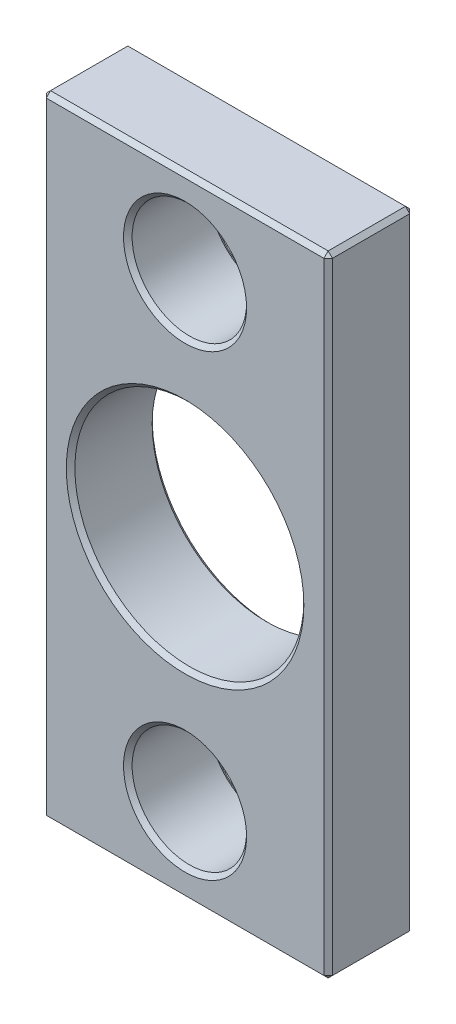
ISO-10303-21;
HEADER;
FILE_DESCRIPTION(('STEP AP214'),'2;1');
FILE_NAME('part.step','',(''),(''),'','','');
FILE_SCHEMA(('AUTOMOTIVE_DESIGN { 1 0 10303 214 1 1 1 1 }'));
ENDSEC;
DATA;
#1=APPLICATION_CONTEXT('core data for automotive mechanical design processes');
#2=APPLICATION_PROTOCOL_DEFINITION('international standard','automotive_design',2000,#1);
#3=PRODUCT_CONTEXT('',#1,'mechanical');
#4=PRODUCT('Part','Part','',(#3));
#5=PRODUCT_RELATED_PRODUCT_CATEGORY('part','',(#4));
#6=PRODUCT_DEFINITION_FORMATION('','',#4);
#7=PRODUCT_DEFINITION_CONTEXT('part definition',#1,'design');
#8=PRODUCT_DEFINITION('design','',#6,#7);
#9=PRODUCT_DEFINITION_SHAPE('','',#8);
#10=(LENGTH_UNIT() NAMED_UNIT(*) SI_UNIT(.MILLI.,.METRE.));
#11=(NAMED_UNIT(*) PLANE_ANGLE_UNIT() SI_UNIT($,.RADIAN.));
#12=(NAMED_UNIT(*) SI_UNIT($,.STERADIAN.) SOLID_ANGLE_UNIT());
#13=UNCERTAINTY_MEASURE_WITH_UNIT(LENGTH_MEASURE(1.E-05),#10,'distance_accuracy_value','');
#14=(GEOMETRIC_REPRESENTATION_CONTEXT(3) GLOBAL_UNCERTAINTY_ASSIGNED_CONTEXT((#13)) GLOBAL_UNIT_ASSIGNED_CONTEXT((#10,
#11,#12)) REPRESENTATION_CONTEXT('',''));
#15=CARTESIAN_POINT('',(0.,0.,0.));
#16=DIRECTION('',(0.,0.,1.));
#17=DIRECTION('',(1.,0.,0.));
#18=AXIS2_PLACEMENT_3D('',#15,#16,#17);
#19=CARTESIAN_POINT('',(0.,0.,1.5));
#20=DIRECTION('',(0.,0.,1.));
#21=DIRECTION('',(1.,0.,0.));
#22=AXIS2_PLACEMENT_3D('',#19,#20,#21);
#23=PLANE('',#22);
#24=CARTESIAN_POINT('',(0.,8.,1.5));
#25=DIRECTION('',(0.,0.,1.));
#26=DIRECTION('',(1.,0.,0.));
#27=AXIS2_PLACEMENT_3D('',#24,#25,#26);
#28=CIRCLE('',#27,2.15);
#29=CARTESIAN_POINT('',(2.15,8.,1.5));
#30=VERTEX_POINT('',#29);
#31=EDGE_CURVE('E228',#30,#30,#28,.F.);
#32=ORIENTED_EDGE('',*,*,#31,.T.);
#33=EDGE_LOOP('',(#32));
#34=FACE_BOUND('',#33,.T.);
#35=CARTESIAN_POINT('',(0.,0.,1.5));
#36=DIRECTION('',(0.,0.,1.));
#37=DIRECTION('',(1.,0.,0.));
#38=AXIS2_PLACEMENT_3D('',#35,#36,#37);
#39=CIRCLE('',#38,4.15);
#40=CARTESIAN_POINT('',(4.15,0.,1.5));
#41=VERTEX_POINT('',#40);
#42=EDGE_CURVE('E224',#41,#41,#39,.F.);
#43=ORIENTED_EDGE('',*,*,#42,.T.);
#44=EDGE_LOOP('',(#43));
#45=FACE_BOUND('',#44,.T.);
#46=DIRECTION('',(0.,1.,0.));
#47=VECTOR('',#46,1.);
#48=CARTESIAN_POINT('',(4.85,11.,1.5));
#49=LINE('',#48,#47);
#50=CARTESIAN_POINT('',(4.85,-10.85,1.5));
#51=VERTEX_POINT('',#50);
#52=CARTESIAN_POINT('',(4.85,10.85,1.5));
#53=VERTEX_POINT('',#52);
#54=EDGE_CURVE('E225',#51,#53,#49,.T.);
#55=ORIENTED_EDGE('',*,*,#54,.T.);
#56=DIRECTION('',(-1.,0.,0.));
#57=VECTOR('',#56,1.);
#58=CARTESIAN_POINT('',(-5.,10.85,1.5));
#59=LINE('',#58,#57);
#60=CARTESIAN_POINT('',(-4.85,10.85,1.5));
#61=VERTEX_POINT('',#60);
#62=EDGE_CURVE('E222',#53,#61,#59,.T.);
#63=ORIENTED_EDGE('',*,*,#62,.T.);
#64=DIRECTION('',(0.,-1.,0.));
#65=VECTOR('',#64,1.);
#66=CARTESIAN_POINT('',(-4.85,-11.,1.5));
#67=LINE('',#66,#65);
#68=CARTESIAN_POINT('',(-4.85,-10.85,1.5));
#69=VERTEX_POINT('',#68);
#70=EDGE_CURVE('E288',#61,#69,#67,.T.);
#71=ORIENTED_EDGE('',*,*,#70,.T.);
#72=DIRECTION('',(1.,0.,0.));
#73=VECTOR('',#72,1.);
#74=CARTESIAN_POINT('',(5.,-10.85,1.5));
#75=LINE('',#74,#73);
#76=EDGE_CURVE('E230',#69,#51,#75,.T.);
#77=ORIENTED_EDGE('',*,*,#76,.T.);
#78=EDGE_LOOP('',(#55,#63,#71,#77));
#79=FACE_BOUND('',#78,.T.);
#80=CARTESIAN_POINT('',(0.,-8.,1.5));
#81=DIRECTION('',(0.,0.,1.));
#82=DIRECTION('',(1.,0.,0.));
#83=AXIS2_PLACEMENT_3D('',#80,#81,#82);
#84=CIRCLE('',#83,2.15);
#85=CARTESIAN_POINT('',(2.15,-8.,1.5));
#86=VERTEX_POINT('',#85);
#87=EDGE_CURVE('E325',#86,#86,#84,.F.);
#88=ORIENTED_EDGE('',*,*,#87,.T.);
#89=EDGE_LOOP('',(#88));
#90=FACE_BOUND('',#89,.T.);
#91=ADVANCED_FACE('F39',(#34,#45,#79,#90),#23,.T.);
#92=CARTESIAN_POINT('',(0.,0.,-1.5));
#93=DIRECTION('',(0.,0.,1.));
#94=DIRECTION('',(1.,0.,0.));
#95=AXIS2_PLACEMENT_3D('',#92,#93,#94);
#96=PLANE('',#95);
#97=CARTESIAN_POINT('',(0.,8.,-1.5));
#98=DIRECTION('',(0.,0.,1.));
#99=DIRECTION('',(1.,0.,0.));
#100=AXIS2_PLACEMENT_3D('',#97,#98,#99);
#101=CIRCLE('',#100,2.15);
#102=CARTESIAN_POINT('',(2.15,8.,-1.5));
#103=VERTEX_POINT('',#102);
#104=EDGE_CURVE('E348',#103,#103,#101,.T.);
#105=ORIENTED_EDGE('',*,*,#104,.T.);
#106=EDGE_LOOP('',(#105));
#107=FACE_BOUND('',#106,.T.);
#108=CARTESIAN_POINT('',(0.,-8.,-1.5));
#109=DIRECTION('',(0.,0.,1.));
#110=DIRECTION('',(1.,0.,0.));
#111=AXIS2_PLACEMENT_3D('',#108,#109,#110);
#112=CIRCLE('',#111,2.15);
#113=CARTESIAN_POINT('',(2.15,-8.,-1.5));
#114=VERTEX_POINT('',#113);
#115=EDGE_CURVE('E351',#114,#114,#112,.T.);
#116=ORIENTED_EDGE('',*,*,#115,.T.);
#117=EDGE_LOOP('',(#116));
#118=FACE_BOUND('',#117,.T.);
#119=CARTESIAN_POINT('',(0.,0.,-1.5));
#120=DIRECTION('',(0.,0.,1.));
#121=DIRECTION('',(1.,0.,0.));
#122=AXIS2_PLACEMENT_3D('',#119,#120,#121);
#123=CIRCLE('',#122,4.14999999999999);
#124=CARTESIAN_POINT('',(4.14999999999999,0.,-1.5));
#125=VERTEX_POINT('',#124);
#126=EDGE_CURVE('E354',#125,#125,#123,.T.);
#127=ORIENTED_EDGE('',*,*,#126,.T.);
#128=EDGE_LOOP('',(#127));
#129=FACE_BOUND('',#128,.T.);
#130=DIRECTION('',(0.,-1.,0.));
#131=VECTOR('',#130,1.);
#132=CARTESIAN_POINT('',(4.85,0.,-1.5));
#133=LINE('',#132,#131);
#134=CARTESIAN_POINT('',(4.85,10.85,-1.5));
#135=VERTEX_POINT('',#134);
#136=CARTESIAN_POINT('',(4.85,-10.85,-1.5));
#137=VERTEX_POINT('',#136);
#138=EDGE_CURVE('E138',#135,#137,#133,.T.);
#139=ORIENTED_EDGE('',*,*,#138,.T.);
#140=DIRECTION('',(-1.,0.,0.));
#141=VECTOR('',#140,1.);
#142=CARTESIAN_POINT('',(0.,-10.85,-1.5));
#143=LINE('',#142,#141);
#144=CARTESIAN_POINT('',(-4.85,-10.85,-1.5));
#145=VERTEX_POINT('',#144);
#146=EDGE_CURVE('E134',#137,#145,#143,.T.);
#147=ORIENTED_EDGE('',*,*,#146,.T.);
#148=DIRECTION('',(0.,1.,0.));
#149=VECTOR('',#148,1.);
#150=CARTESIAN_POINT('',(-4.85,0.,-1.5));
#151=LINE('',#150,#149);
#152=CARTESIAN_POINT('',(-4.85,10.85,-1.5));
#153=VERTEX_POINT('',#152);
#154=EDGE_CURVE('E129',#145,#153,#151,.T.);
#155=ORIENTED_EDGE('',*,*,#154,.T.);
#156=DIRECTION('',(1.,0.,0.));
#157=VECTOR('',#156,1.);
#158=CARTESIAN_POINT('',(0.,10.85,-1.5));
#159=LINE('',#158,#157);
#160=EDGE_CURVE('E132',#153,#135,#159,.T.);
#161=ORIENTED_EDGE('',*,*,#160,.T.);
#162=EDGE_LOOP('',(#139,#147,#155,#161));
#163=FACE_BOUND('',#162,.T.);
#164=ADVANCED_FACE('F131',(#107,#118,#129,#163),#96,.F.);
#165=CARTESIAN_POINT('',(-5.,11.,1.5));
#166=DIRECTION('',(1.,0.,0.));
#167=DIRECTION('',(0.,0.,-1.));
#168=AXIS2_PLACEMENT_3D('',#165,#166,#167);
#169=PLANE('',#168);
#170=DIRECTION('',(0.,-1.,0.));
#171=VECTOR('',#170,1.);
#172=CARTESIAN_POINT('',(-5.,11.,-1.35));
#173=LINE('',#172,#171);
#174=CARTESIAN_POINT('',(-5.,10.85,-1.35));
#175=VERTEX_POINT('',#174);
#176=CARTESIAN_POINT('',(-5.,-10.85,-1.35));
#177=VERTEX_POINT('',#176);
#178=EDGE_CURVE('E157',#175,#177,#173,.T.);
#179=ORIENTED_EDGE('',*,*,#178,.T.);
#180=DIRECTION('',(0.,0.,1.));
#181=VECTOR('',#180,1.);
#182=CARTESIAN_POINT('',(-5.,-10.85,1.5));
#183=LINE('',#182,#181);
#184=CARTESIAN_POINT('',(-5.,-10.85,1.35));
#185=VERTEX_POINT('',#184);
#186=EDGE_CURVE('E250',#177,#185,#183,.T.);
#187=ORIENTED_EDGE('',*,*,#186,.T.);
#188=DIRECTION('',(0.,1.,0.));
#189=VECTOR('',#188,1.);
#190=CARTESIAN_POINT('',(-5.,11.,1.35));
#191=LINE('',#190,#189);
#192=CARTESIAN_POINT('',(-5.,10.85,1.35));
#193=VERTEX_POINT('',#192);
#194=EDGE_CURVE('E245',#185,#193,#191,.T.);
#195=ORIENTED_EDGE('',*,*,#194,.T.);
#196=DIRECTION('',(0.,0.,-1.));
#197=VECTOR('',#196,1.);
#198=CARTESIAN_POINT('',(-5.,10.85,1.5));
#199=LINE('',#198,#197);
#200=EDGE_CURVE('E247',#193,#175,#199,.T.);
#201=ORIENTED_EDGE('',*,*,#200,.T.);
#202=EDGE_LOOP('',(#179,#187,#195,#201));
#203=FACE_BOUND('',#202,.T.);
#204=ADVANCED_FACE('F295',(#203),#169,.F.);
#205=CARTESIAN_POINT('',(-5.,-11.,1.5));
#206=DIRECTION('',(0.,1.,0.));
#207=DIRECTION('',(0.,0.,1.));
#208=AXIS2_PLACEMENT_3D('',#205,#206,#207);
#209=PLANE('',#208);
#210=DIRECTION('',(-1.,0.,0.));
#211=VECTOR('',#210,1.);
#212=CARTESIAN_POINT('',(-5.,-11.,1.35));
#213=LINE('',#212,#211);
#214=CARTESIAN_POINT('',(4.85,-11.,1.35));
#215=VERTEX_POINT('',#214);
#216=CARTESIAN_POINT('',(-4.85,-11.,1.35));
#217=VERTEX_POINT('',#216);
#218=EDGE_CURVE('E236',#215,#217,#213,.T.);
#219=ORIENTED_EDGE('',*,*,#218,.T.);
#220=DIRECTION('',(0.,0.,-1.));
#221=VECTOR('',#220,1.);
#222=CARTESIAN_POINT('',(-4.85,-11.,1.5));
#223=LINE('',#222,#221);
#224=CARTESIAN_POINT('',(-4.85,-11.,-1.35));
#225=VERTEX_POINT('',#224);
#226=EDGE_CURVE('E242',#217,#225,#223,.T.);
#227=ORIENTED_EDGE('',*,*,#226,.T.);
#228=DIRECTION('',(1.,0.,0.));
#229=VECTOR('',#228,1.);
#230=CARTESIAN_POINT('',(-5.,-11.,-1.35));
#231=LINE('',#230,#229);
#232=CARTESIAN_POINT('',(4.85,-11.,-1.35));
#233=VERTEX_POINT('',#232);
#234=EDGE_CURVE('E240',#225,#233,#231,.T.);
#235=ORIENTED_EDGE('',*,*,#234,.T.);
#236=DIRECTION('',(0.,0.,1.));
#237=VECTOR('',#236,1.);
#238=CARTESIAN_POINT('',(4.85,-11.,1.5));
#239=LINE('',#238,#237);
#240=EDGE_CURVE('E238',#233,#215,#239,.T.);
#241=ORIENTED_EDGE('',*,*,#240,.T.);
#242=EDGE_LOOP('',(#219,#227,#235,#241));
#243=FACE_BOUND('',#242,.T.);
#244=ADVANCED_FACE('F308',(#243),#209,.F.);
#245=CARTESIAN_POINT('',(5.,11.,1.5));
#246=DIRECTION('',(-1.,0.,0.));
#247=DIRECTION('',(0.,0.,1.));
#248=AXIS2_PLACEMENT_3D('',#245,#246,#247);
#249=PLANE('',#248);
#250=DIRECTION('',(0.,-1.,0.));
#251=VECTOR('',#250,1.);
#252=CARTESIAN_POINT('',(5.,-11.,1.35));
#253=LINE('',#252,#251);
#254=CARTESIAN_POINT('',(5.,10.85,1.35));
#255=VERTEX_POINT('',#254);
#256=CARTESIAN_POINT('',(5.,-10.85,1.35));
#257=VERTEX_POINT('',#256);
#258=EDGE_CURVE('E253',#255,#257,#253,.T.);
#259=ORIENTED_EDGE('',*,*,#258,.T.);
#260=DIRECTION('',(0.,0.,-1.));
#261=VECTOR('',#260,1.);
#262=CARTESIAN_POINT('',(5.,-10.85,1.5));
#263=LINE('',#262,#261);
#264=CARTESIAN_POINT('',(5.,-10.85,-1.35));
#265=VERTEX_POINT('',#264);
#266=EDGE_CURVE('E259',#257,#265,#263,.T.);
#267=ORIENTED_EDGE('',*,*,#266,.T.);
#268=DIRECTION('',(0.,1.,0.));
#269=VECTOR('',#268,1.);
#270=CARTESIAN_POINT('',(5.,11.,-1.35));
#271=LINE('',#270,#269);
#272=CARTESIAN_POINT('',(5.,10.85,-1.35));
#273=VERTEX_POINT('',#272);
#274=EDGE_CURVE('E257',#265,#273,#271,.T.);
#275=ORIENTED_EDGE('',*,*,#274,.T.);
#276=DIRECTION('',(0.,0.,1.));
#277=VECTOR('',#276,1.);
#278=CARTESIAN_POINT('',(5.,10.85,1.5));
#279=LINE('',#278,#277);
#280=EDGE_CURVE('E255',#273,#255,#279,.T.);
#281=ORIENTED_EDGE('',*,*,#280,.T.);
#282=EDGE_LOOP('',(#259,#267,#275,#281));
#283=FACE_BOUND('',#282,.T.);
#284=ADVANCED_FACE('F730',(#283),#249,.F.);
#285=CARTESIAN_POINT('',(-5.,11.,1.5));
#286=DIRECTION('',(0.,-1.,0.));
#287=DIRECTION('',(0.,0.,-1.));
#288=AXIS2_PLACEMENT_3D('',#285,#286,#287);
#289=PLANE('',#288);
#290=DIRECTION('',(1.,0.,0.));
#291=VECTOR('',#290,1.);
#292=CARTESIAN_POINT('',(5.,11.,1.35));
#293=LINE('',#292,#291);
#294=CARTESIAN_POINT('',(-4.85,11.,1.35));
#295=VERTEX_POINT('',#294);
#296=CARTESIAN_POINT('',(4.85,11.,1.35));
#297=VERTEX_POINT('',#296);
#298=EDGE_CURVE('E219',#295,#297,#293,.T.);
#299=ORIENTED_EDGE('',*,*,#298,.T.);
#300=DIRECTION('',(0.,0.,-1.));
#301=VECTOR('',#300,1.);
#302=CARTESIAN_POINT('',(4.85,11.,1.5));
#303=LINE('',#302,#301);
#304=CARTESIAN_POINT('',(4.85,11.,-1.35));
#305=VERTEX_POINT('',#304);
#306=EDGE_CURVE('E11',#297,#305,#303,.T.);
#307=ORIENTED_EDGE('',*,*,#306,.T.);
#308=DIRECTION('',(-1.,0.,0.));
#309=VECTOR('',#308,1.);
#310=CARTESIAN_POINT('',(-5.,11.,-1.35));
#311=LINE('',#310,#309);
#312=CARTESIAN_POINT('',(-4.85,11.,-1.35));
#313=VERTEX_POINT('',#312);
#314=EDGE_CURVE('E49',#305,#313,#311,.T.);
#315=ORIENTED_EDGE('',*,*,#314,.T.);
#316=DIRECTION('',(0.,0.,1.));
#317=VECTOR('',#316,1.);
#318=CARTESIAN_POINT('',(-4.85,11.,1.5));
#319=LINE('',#318,#317);
#320=EDGE_CURVE('E263',#313,#295,#319,.T.);
#321=ORIENTED_EDGE('',*,*,#320,.T.);
#322=EDGE_LOOP('',(#299,#307,#315,#321));
#323=FACE_BOUND('',#322,.T.);
#324=ADVANCED_FACE('F719',(#323),#289,.F.);
#325=CARTESIAN_POINT('',(0.,0.,1.5));
#326=DIRECTION('',(0.,0.,-1.));
#327=DIRECTION('',(-1.,0.,0.));
#328=AXIS2_PLACEMENT_3D('',#325,#326,#327);
#329=CYLINDRICAL_SURFACE('',#328,4.);
#330=CARTESIAN_POINT('',(0.,0.,-1.35));
#331=DIRECTION('',(0.,0.,1.));
#332=DIRECTION('',(1.,0.,0.));
#333=AXIS2_PLACEMENT_3D('',#330,#331,#332);
#334=CIRCLE('',#333,4.);
#335=CARTESIAN_POINT('',(4.,0.,-1.35));
#336=VERTEX_POINT('',#335);
#337=EDGE_CURVE('E327',#336,#336,#334,.F.);
#338=ORIENTED_EDGE('',*,*,#337,.T.);
#339=EDGE_LOOP('',(#338));
#340=FACE_BOUND('',#339,.T.);
#341=CARTESIAN_POINT('',(0.,0.,1.35));
#342=DIRECTION('',(0.,0.,1.));
#343=DIRECTION('',(1.,0.,0.));
#344=AXIS2_PLACEMENT_3D('',#341,#342,#343);
#345=CIRCLE('',#344,4.);
#346=CARTESIAN_POINT('',(4.,0.,1.35));
#347=VERTEX_POINT('',#346);
#348=EDGE_CURVE('E331',#347,#347,#345,.T.);
#349=ORIENTED_EDGE('',*,*,#348,.T.);
#350=EDGE_LOOP('',(#349));
#351=FACE_BOUND('',#350,.T.);
#352=ADVANCED_FACE('F708',(#340,#351),#329,.F.);
#353=CARTESIAN_POINT('',(0.,-8.,1.5));
#354=DIRECTION('',(0.,0.,-1.));
#355=DIRECTION('',(-1.,0.,0.));
#356=AXIS2_PLACEMENT_3D('',#353,#354,#355);
#357=CYLINDRICAL_SURFACE('',#356,2.);
#358=CARTESIAN_POINT('',(0.,-8.,-1.35));
#359=DIRECTION('',(0.,0.,1.));
#360=DIRECTION('',(1.,0.,0.));
#361=AXIS2_PLACEMENT_3D('',#358,#359,#360);
#362=CIRCLE('',#361,2.);
#363=CARTESIAN_POINT('',(2.,-8.,-1.35));
#364=VERTEX_POINT('',#363);
#365=EDGE_CURVE('E336',#364,#364,#362,.F.);
#366=ORIENTED_EDGE('',*,*,#365,.T.);
#367=EDGE_LOOP('',(#366));
#368=FACE_BOUND('',#367,.T.);
#369=CARTESIAN_POINT('',(0.,-8.,1.35));
#370=DIRECTION('',(0.,0.,1.));
#371=DIRECTION('',(1.,0.,0.));
#372=AXIS2_PLACEMENT_3D('',#369,#370,#371);
#373=CIRCLE('',#372,2.);
#374=CARTESIAN_POINT('',(2.,-8.,1.35));
#375=VERTEX_POINT('',#374);
#376=EDGE_CURVE('E339',#375,#375,#373,.T.);
#377=ORIENTED_EDGE('',*,*,#376,.T.);
#378=EDGE_LOOP('',(#377));
#379=FACE_BOUND('',#378,.T.);
#380=ADVANCED_FACE('F697',(#368,#379),#357,.F.);
#381=CARTESIAN_POINT('',(0.,8.,1.5));
#382=DIRECTION('',(0.,0.,-1.));
#383=DIRECTION('',(-1.,0.,0.));
#384=AXIS2_PLACEMENT_3D('',#381,#382,#383);
#385=CYLINDRICAL_SURFACE('',#384,2.);
#386=CARTESIAN_POINT('',(0.,8.,-1.35));
#387=DIRECTION('',(0.,0.,1.));
#388=DIRECTION('',(1.,0.,0.));
#389=AXIS2_PLACEMENT_3D('',#386,#387,#388);
#390=CIRCLE('',#389,2.);
#391=CARTESIAN_POINT('',(2.,8.,-1.35));
#392=VERTEX_POINT('',#391);
#393=EDGE_CURVE('E342',#392,#392,#390,.F.);
#394=ORIENTED_EDGE('',*,*,#393,.T.);
#395=EDGE_LOOP('',(#394));
#396=FACE_BOUND('',#395,.T.);
#397=CARTESIAN_POINT('',(0.,8.,1.35));
#398=DIRECTION('',(0.,0.,1.));
#399=DIRECTION('',(1.,0.,0.));
#400=AXIS2_PLACEMENT_3D('',#397,#398,#399);
#401=CIRCLE('',#400,2.);
#402=CARTESIAN_POINT('',(2.,8.,1.35));
#403=VERTEX_POINT('',#402);
#404=EDGE_CURVE('E345',#403,#403,#401,.T.);
#405=ORIENTED_EDGE('',*,*,#404,.T.);
#406=EDGE_LOOP('',(#405));
#407=FACE_BOUND('',#406,.T.);
#408=ADVANCED_FACE('F686',(#396,#407),#385,.F.);
#409=CARTESIAN_POINT('',(0.,8.,-1.5));
#410=DIRECTION('',(0.,0.,-1.));
#411=DIRECTION('',(-1.,0.,0.));
#412=AXIS2_PLACEMENT_3D('',#409,#410,#411);
#413=CONICAL_SURFACE('',#412,2.15,0.785398163397446);
#414=ORIENTED_EDGE('',*,*,#393,.F.);
#415=EDGE_LOOP('',(#414));
#416=FACE_BOUND('',#415,.T.);
#417=ORIENTED_EDGE('',*,*,#104,.F.);
#418=EDGE_LOOP('',(#417));
#419=FACE_BOUND('',#418,.T.);
#420=ADVANCED_FACE('F675',(#416,#419),#413,.F.);
#421=CARTESIAN_POINT('',(0.,-8.,-1.5));
#422=DIRECTION('',(0.,0.,-1.));
#423=DIRECTION('',(-1.,0.,0.));
#424=AXIS2_PLACEMENT_3D('',#421,#422,#423);
#425=CONICAL_SURFACE('',#424,2.15,0.785398163397446);
#426=ORIENTED_EDGE('',*,*,#365,.F.);
#427=EDGE_LOOP('',(#426));
#428=FACE_BOUND('',#427,.T.);
#429=ORIENTED_EDGE('',*,*,#115,.F.);
#430=EDGE_LOOP('',(#429));
#431=FACE_BOUND('',#430,.T.);
#432=ADVANCED_FACE('F665',(#428,#431),#425,.F.);
#433=CARTESIAN_POINT('',(0.,0.,-1.5));
#434=DIRECTION('',(0.,0.,-1.));
#435=DIRECTION('',(-1.,0.,0.));
#436=AXIS2_PLACEMENT_3D('',#433,#434,#435);
#437=CONICAL_SURFACE('',#436,4.14999999999999,0.78539816339744);
#438=ORIENTED_EDGE('',*,*,#337,.F.);
#439=EDGE_LOOP('',(#438));
#440=FACE_BOUND('',#439,.T.);
#441=ORIENTED_EDGE('',*,*,#126,.F.);
#442=EDGE_LOOP('',(#441));
#443=FACE_BOUND('',#442,.T.);
#444=ADVANCED_FACE('F447',(#440,#443),#437,.F.);
#445=CARTESIAN_POINT('',(0.,8.,1.35));
#446=DIRECTION('',(0.,0.,1.));
#447=DIRECTION('',(1.,0.,0.));
#448=AXIS2_PLACEMENT_3D('',#445,#446,#447);
#449=CONICAL_SURFACE('',#448,2.,0.785398163397446);
#450=ORIENTED_EDGE('',*,*,#31,.F.);
#451=EDGE_LOOP('',(#450));
#452=FACE_BOUND('',#451,.T.);
#453=ORIENTED_EDGE('',*,*,#404,.F.);
#454=EDGE_LOOP('',(#453));
#455=FACE_BOUND('',#454,.T.);
#456=ADVANCED_FACE('F441',(#452,#455),#449,.F.);
#457=CARTESIAN_POINT('',(0.,0.,1.35));
#458=DIRECTION('',(0.,0.,1.));
#459=DIRECTION('',(1.,0.,0.));
#460=AXIS2_PLACEMENT_3D('',#457,#458,#459);
#461=CONICAL_SURFACE('',#460,4.,0.785398163397454);
#462=CARTESIAN_POINT('',(4.15,0.,1.5));
#463=CARTESIAN_POINT('',(4.1484375,0.,1.4984375));
#464=CARTESIAN_POINT('',(4.146875,0.,1.496875));
#465=CARTESIAN_POINT('',(4.14375,0.,1.49375));
#466=CARTESIAN_POINT('',(4.1421875,0.,1.4921875));
#467=CARTESIAN_POINT('',(4.1390625,0.,1.4890625));
#468=CARTESIAN_POINT('',(4.1375,0.,1.4875));
#469=CARTESIAN_POINT('',(4.134375,0.,1.484375));
#470=CARTESIAN_POINT('',(4.1328125,0.,1.4828125));
#471=CARTESIAN_POINT('',(4.1296875,0.,1.4796875));
#472=CARTESIAN_POINT('',(4.128125,0.,1.478125));
#473=CARTESIAN_POINT('',(4.125,0.,1.475));
#474=CARTESIAN_POINT('',(4.1234375,0.,1.4734375));
#475=CARTESIAN_POINT('',(4.1203125,0.,1.4703125));
#476=CARTESIAN_POINT('',(4.11875,0.,1.46875));
#477=CARTESIAN_POINT('',(4.115625,0.,1.465625));
#478=CARTESIAN_POINT('',(4.1140625,0.,1.4640625));
#479=CARTESIAN_POINT('',(4.1109375,0.,1.4609375));
#480=CARTESIAN_POINT('',(4.109375,0.,1.459375));
#481=CARTESIAN_POINT('',(4.10625,0.,1.45625));
#482=CARTESIAN_POINT('',(4.1046875,0.,1.4546875));
#483=CARTESIAN_POINT('',(4.1015625,0.,1.4515625));
#484=CARTESIAN_POINT('',(4.1,0.,1.45));
#485=CARTESIAN_POINT('',(4.096875,0.,1.446875));
#486=CARTESIAN_POINT('',(4.0953125,0.,1.4453125));
#487=CARTESIAN_POINT('',(4.0921875,0.,1.4421875));
#488=CARTESIAN_POINT('',(4.090625,0.,1.440625));
#489=CARTESIAN_POINT('',(4.0875,0.,1.4375));
#490=CARTESIAN_POINT('',(4.0859375,0.,1.4359375));
#491=CARTESIAN_POINT('',(4.0828125,0.,1.4328125));
#492=CARTESIAN_POINT('',(4.08125,0.,1.43125));
#493=CARTESIAN_POINT('',(4.078125,0.,1.428125));
#494=CARTESIAN_POINT('',(4.0765625,0.,1.4265625));
#495=CARTESIAN_POINT('',(4.0734375,0.,1.4234375));
#496=CARTESIAN_POINT('',(4.071875,0.,1.421875));
#497=CARTESIAN_POINT('',(4.06875,0.,1.41875));
#498=CARTESIAN_POINT('',(4.0671875,0.,1.4171875));
#499=CARTESIAN_POINT('',(4.0640625,0.,1.4140625));
#500=CARTESIAN_POINT('',(4.0625,0.,1.4125));
#501=CARTESIAN_POINT('',(4.059375,0.,1.409375));
#502=CARTESIAN_POINT('',(4.0578125,0.,1.4078125));
#503=CARTESIAN_POINT('',(4.0546875,0.,1.4046875));
#504=CARTESIAN_POINT('',(4.053125,0.,1.403125));
#505=CARTESIAN_POINT('',(4.05,0.,1.4));
#506=CARTESIAN_POINT('',(4.0484375,0.,1.3984375));
#507=CARTESIAN_POINT('',(4.0453125,0.,1.3953125));
#508=CARTESIAN_POINT('',(4.04375,0.,1.39375));
#509=CARTESIAN_POINT('',(4.040625,0.,1.390625));
#510=CARTESIAN_POINT('',(4.0390625,0.,1.3890625));
#511=CARTESIAN_POINT('',(4.0359375,0.,1.3859375));
#512=CARTESIAN_POINT('',(4.034375,0.,1.384375));
#513=CARTESIAN_POINT('',(4.03125,0.,1.38125));
#514=CARTESIAN_POINT('',(4.0296875,0.,1.3796875));
#515=CARTESIAN_POINT('',(4.0265625,0.,1.3765625));
#516=CARTESIAN_POINT('',(4.025,0.,1.375));
#517=CARTESIAN_POINT('',(4.021875,0.,1.371875));
#518=CARTESIAN_POINT('',(4.0203125,0.,1.3703125));
#519=CARTESIAN_POINT('',(4.0171875,0.,1.3671875));
#520=CARTESIAN_POINT('',(4.015625,0.,1.365625));
#521=CARTESIAN_POINT('',(4.0125,0.,1.3625));
#522=CARTESIAN_POINT('',(4.0109375,0.,1.3609375));
#523=CARTESIAN_POINT('',(4.0078125,0.,1.3578125));
#524=CARTESIAN_POINT('',(4.00625,0.,1.35625));
#525=CARTESIAN_POINT('',(4.003125,0.,1.353125));
#526=CARTESIAN_POINT('',(4.0015625,0.,1.3515625));
#527=CARTESIAN_POINT('',(4.,0.,1.35));
#528=B_SPLINE_CURVE_WITH_KNOTS('',3,(#462,#463,#464,#465,#466,#467,#468,#469,#470,#471,#472,
#473,#474,#475,#476,#477,#478,#479,#480,#481,#482,#483,#484,#485,#486,#487,#488,#489,#490,#491,
#492,#493,#494,#495,#496,#497,#498,#499,#500,#501,#502,#503,#504,#505,#506,#507,#508,#509,#510,
#511,#512,#513,#514,#515,#516,#517,#518,#519,#520,#521,#522,#523,#524,#525,#526,#527),
.UNSPECIFIED.,.F.,.F.,(4,2,2,2,2,2,2,2,2,2,2,2,2,2,2,2,2,2,2,2,2,2,2,2,2,2,2,2,2,2,2,2,4),(0.,
0.00662912607362407,0.0132582521472483,0.0198873782208719,0.0265165042944961,0.0331456303681202,
0.0397747564417444,0.0464038825153681,0.0530330085889923,0.0596621346626163,0.0662912607362406,
0.0729203868098642,0.0795495128834884,0.0861786389571125,0.0928077650307367,0.0994368911043603,
0.106066017177985,0.112695143251609,0.119324269325233,0.125953395398856,0.132582521472481,
0.139211647546105,0.145840773619729,0.152469899693353,0.159099025766977,0.165728151840601,
0.172357277914225,0.178986403987849,0.185615530061473,0.192244656135097,0.198873782208721,
0.205502908282345,0.212132034355969),.UNSPECIFIED.);
#529=EDGE_CURVE('BSEAM437',#41,#347,#528,.T.);
#530=ORIENTED_EDGE('',*,*,#42,.F.);
#531=ORIENTED_EDGE('',*,*,#348,.F.);
#532=ORIENTED_EDGE('',*,*,#529,.T.);
#533=ORIENTED_EDGE('',*,*,#529,.F.);
#534=EDGE_LOOP('',(#530,#532,#531,#533));
#535=FACE_BOUND('',#534,.T.);
#536=ADVANCED_FACE('F437',(#535),#461,.F.);
#537=CARTESIAN_POINT('',(4.85,11.,1.5));
#538=DIRECTION('',(-0.707106781186556,-0.707106781186539,0.));
#539=DIRECTION('',(0.,0.,-1.));
#540=AXIS2_PLACEMENT_3D('',#537,#538,#539);
#541=PLANE('',#540);
#542=DIRECTION('',(0.707106781186539,-0.707106781186556,0.));
#543=VECTOR('',#542,1.);
#544=CARTESIAN_POINT('',(5.,10.85,1.35));
#545=LINE('',#544,#543);
#546=EDGE_CURVE('E44',#255,#297,#545,.F.);
#547=ORIENTED_EDGE('',*,*,#546,.F.);
#548=ORIENTED_EDGE('',*,*,#280,.F.);
#549=DIRECTION('',(-0.707106781186539,0.707106781186556,0.));
#550=VECTOR('',#549,1.);
#551=CARTESIAN_POINT('',(5.,10.85,-1.35));
#552=LINE('',#551,#550);
#553=EDGE_CURVE('E200',#305,#273,#552,.F.);
#554=ORIENTED_EDGE('',*,*,#553,.F.);
#555=ORIENTED_EDGE('',*,*,#306,.F.);
#556=EDGE_LOOP('',(#547,#548,#554,#555));
#557=FACE_BOUND('',#556,.T.);
#558=ADVANCED_FACE('F432',(#557),#541,.F.);
#559=CARTESIAN_POINT('',(5.,10.85,1.35));
#560=DIRECTION('',(0.577350269189639,0.577350269189626,0.577350269189612));
#561=DIRECTION('',(-0.707106781186539,0.707106781186556,0.));
#562=AXIS2_PLACEMENT_3D('',#559,#560,#561);
#563=PLANE('',#562);
#564=DIRECTION('',(0.707106781186539,0.,-0.707106781186556));
#565=VECTOR('',#564,1.);
#566=CARTESIAN_POINT('',(5.,10.85,1.35));
#567=LINE('',#566,#565);
#568=EDGE_CURVE('E195',#255,#53,#567,.F.);
#569=ORIENTED_EDGE('',*,*,#568,.F.);
#570=ORIENTED_EDGE('',*,*,#546,.T.);
#571=DIRECTION('',(0.,-0.707106781186539,0.707106781186556));
#572=VECTOR('',#571,1.);
#573=CARTESIAN_POINT('',(4.85,10.925,1.425));
#574=LINE('',#573,#572);
#575=EDGE_CURVE('E198',#53,#297,#574,.F.);
#576=ORIENTED_EDGE('',*,*,#575,.F.);
#577=EDGE_LOOP('',(#569,#570,#576));
#578=FACE_BOUND('',#577,.T.);
#579=ADVANCED_FACE('F209',(#578),#563,.T.);
#580=CARTESIAN_POINT('',(5.,10.85,-1.35));
#581=DIRECTION('',(0.577350269189626,0.577350269189613,-0.577350269189639));
#582=DIRECTION('',(-0.707106781186556,0.,-0.707106781186539));
#583=AXIS2_PLACEMENT_3D('',#580,#581,#582);
#584=PLANE('',#583);
#585=DIRECTION('',(0.,-0.707106781186556,-0.707106781186539));
#586=VECTOR('',#585,1.);
#587=CARTESIAN_POINT('',(4.85,10.925,-1.425));
#588=LINE('',#587,#586);
#589=EDGE_CURVE('E144',#305,#135,#588,.T.);
#590=ORIENTED_EDGE('',*,*,#589,.F.);
#591=ORIENTED_EDGE('',*,*,#553,.T.);
#592=DIRECTION('',(0.707106781186556,0.,0.707106781186539));
#593=VECTOR('',#592,1.);
#594=CARTESIAN_POINT('',(5.,10.85,-1.35));
#595=LINE('',#594,#593);
#596=EDGE_CURVE('E192',#135,#273,#595,.T.);
#597=ORIENTED_EDGE('',*,*,#596,.F.);
#598=EDGE_LOOP('',(#590,#591,#597));
#599=FACE_BOUND('',#598,.T.);
#600=ADVANCED_FACE('F422',(#599),#584,.T.);
#601=CARTESIAN_POINT('',(0.,10.85,1.5));
#602=DIRECTION('',(0.,0.707106781186556,0.707106781186539));
#603=DIRECTION('',(1.,0.,0.));
#604=AXIS2_PLACEMENT_3D('',#601,#602,#603);
#605=PLANE('',#604);
#606=ORIENTED_EDGE('',*,*,#575,.T.);
#607=ORIENTED_EDGE('',*,*,#298,.F.);
#608=DIRECTION('',(0.,0.707106781186539,-0.707106781186556));
#609=VECTOR('',#608,1.);
#610=CARTESIAN_POINT('',(-4.85,11.,1.35));
#611=LINE('',#610,#609);
#612=EDGE_CURVE('E185',#61,#295,#611,.T.);
#613=ORIENTED_EDGE('',*,*,#612,.F.);
#614=ORIENTED_EDGE('',*,*,#62,.F.);
#615=EDGE_LOOP('',(#606,#607,#613,#614));
#616=FACE_BOUND('',#615,.T.);
#617=ADVANCED_FACE('F217',(#616),#605,.T.);
#618=CARTESIAN_POINT('',(4.85,0.,1.5));
#619=DIRECTION('',(0.707106781186556,0.,0.707106781186539));
#620=DIRECTION('',(0.,-1.,0.));
#621=AXIS2_PLACEMENT_3D('',#618,#619,#620);
#622=PLANE('',#621);
#623=ORIENTED_EDGE('',*,*,#568,.T.);
#624=ORIENTED_EDGE('',*,*,#54,.F.);
#625=DIRECTION('',(-0.707106781186539,0.,0.707106781186556));
#626=VECTOR('',#625,1.);
#627=CARTESIAN_POINT('',(4.925,-10.85,1.425));
#628=LINE('',#627,#626);
#629=EDGE_CURVE('E182',#257,#51,#628,.T.);
#630=ORIENTED_EDGE('',*,*,#629,.F.);
#631=ORIENTED_EDGE('',*,*,#258,.F.);
#632=EDGE_LOOP('',(#623,#624,#630,#631));
#633=FACE_BOUND('',#632,.T.);
#634=ADVANCED_FACE('F318',(#633),#622,.T.);
#635=CARTESIAN_POINT('',(5.,-10.85,1.5));
#636=DIRECTION('',(-0.707106781186539,0.707106781186556,0.));
#637=DIRECTION('',(0.,0.,-1.));
#638=AXIS2_PLACEMENT_3D('',#635,#636,#637);
#639=PLANE('',#638);
#640=DIRECTION('',(0.707106781186556,0.707106781186539,0.));
#641=VECTOR('',#640,1.);
#642=CARTESIAN_POINT('',(4.85,-11.,-1.35));
#643=LINE('',#642,#641);
#644=EDGE_CURVE('E176',#265,#233,#643,.F.);
#645=ORIENTED_EDGE('',*,*,#644,.F.);
#646=ORIENTED_EDGE('',*,*,#266,.F.);
#647=DIRECTION('',(-0.707106781186556,-0.707106781186539,0.));
#648=VECTOR('',#647,1.);
#649=CARTESIAN_POINT('',(4.85,-11.,1.35));
#650=LINE('',#649,#648);
#651=EDGE_CURVE('E179',#215,#257,#650,.F.);
#652=ORIENTED_EDGE('',*,*,#651,.F.);
#653=ORIENTED_EDGE('',*,*,#240,.F.);
#654=EDGE_LOOP('',(#645,#646,#652,#653));
#655=FACE_BOUND('',#654,.T.);
#656=ADVANCED_FACE('F313',(#655),#639,.F.);
#657=CARTESIAN_POINT('',(5.,11.,-1.35));
#658=DIRECTION('',(-0.707106781186539,0.,0.707106781186556));
#659=DIRECTION('',(0.,1.,0.));
#660=AXIS2_PLACEMENT_3D('',#657,#658,#659);
#661=PLANE('',#660);
#662=ORIENTED_EDGE('',*,*,#596,.T.);
#663=ORIENTED_EDGE('',*,*,#274,.F.);
#664=DIRECTION('',(-0.707106781186556,0.,-0.707106781186539));
#665=VECTOR('',#664,1.);
#666=CARTESIAN_POINT('',(4.925,-10.85,-1.425));
#667=LINE('',#666,#665);
#668=EDGE_CURVE('E154',#137,#265,#667,.F.);
#669=ORIENTED_EDGE('',*,*,#668,.F.);
#670=ORIENTED_EDGE('',*,*,#138,.F.);
#671=EDGE_LOOP('',(#662,#663,#669,#670));
#672=FACE_BOUND('',#671,.T.);
#673=ADVANCED_FACE('F362',(#672),#661,.F.);
#674=CARTESIAN_POINT('',(-5.,11.,-1.35));
#675=DIRECTION('',(0.,-0.707106781186539,0.707106781186556));
#676=DIRECTION('',(-1.,0.,0.));
#677=AXIS2_PLACEMENT_3D('',#674,#675,#676);
#678=PLANE('',#677);
#679=ORIENTED_EDGE('',*,*,#589,.T.);
#680=ORIENTED_EDGE('',*,*,#160,.F.);
#681=DIRECTION('',(0.,0.707106781186556,0.707106781186539));
#682=VECTOR('',#681,1.);
#683=CARTESIAN_POINT('',(-4.85,10.85,-1.5));
#684=LINE('',#683,#682);
#685=EDGE_CURVE('E142',#313,#153,#684,.F.);
#686=ORIENTED_EDGE('',*,*,#685,.F.);
#687=ORIENTED_EDGE('',*,*,#314,.F.);
#688=EDGE_LOOP('',(#679,#680,#686,#687));
#689=FACE_BOUND('',#688,.T.);
#690=ADVANCED_FACE('F141',(#689),#678,.F.);
#691=CARTESIAN_POINT('',(-5.,10.85,1.5));
#692=DIRECTION('',(0.707106781186556,-0.707106781186539,0.));
#693=DIRECTION('',(0.,0.,-1.));
#694=AXIS2_PLACEMENT_3D('',#691,#692,#693);
#695=PLANE('',#694);
#696=DIRECTION('',(0.707106781186539,0.707106781186556,0.));
#697=VECTOR('',#696,1.);
#698=CARTESIAN_POINT('',(-4.85,11.,1.35));
#699=LINE('',#698,#697);
#700=EDGE_CURVE('E188',#295,#193,#699,.F.);
#701=ORIENTED_EDGE('',*,*,#700,.F.);
#702=ORIENTED_EDGE('',*,*,#320,.F.);
#703=DIRECTION('',(-0.707106781186539,-0.707106781186556,0.));
#704=VECTOR('',#703,1.);
#705=CARTESIAN_POINT('',(-4.925,10.925,-1.35));
#706=LINE('',#705,#704);
#707=EDGE_CURVE('E153',#175,#313,#706,.F.);
#708=ORIENTED_EDGE('',*,*,#707,.F.);
#709=ORIENTED_EDGE('',*,*,#200,.F.);
#710=EDGE_LOOP('',(#701,#702,#708,#709));
#711=FACE_BOUND('',#710,.T.);
#712=ADVANCED_FACE('F389',(#711),#695,.F.);
#713=CARTESIAN_POINT('',(-4.85,11.,1.35));
#714=DIRECTION('',(-0.577350269189639,0.577350269189626,0.577350269189612));
#715=DIRECTION('',(-0.707106781186539,-0.707106781186556,0.));
#716=AXIS2_PLACEMENT_3D('',#713,#714,#715);
#717=PLANE('',#716);
#718=ORIENTED_EDGE('',*,*,#612,.T.);
#719=ORIENTED_EDGE('',*,*,#700,.T.);
#720=DIRECTION('',(0.707106781186539,0.,0.707106781186556));
#721=VECTOR('',#720,1.);
#722=CARTESIAN_POINT('',(-4.925,10.85,1.425));
#723=LINE('',#722,#721);
#724=EDGE_CURVE('E171',#61,#193,#723,.F.);
#725=ORIENTED_EDGE('',*,*,#724,.F.);
#726=EDGE_LOOP('',(#718,#719,#725));
#727=FACE_BOUND('',#726,.T.);
#728=ADVANCED_FACE('F372',(#727),#717,.T.);
#729=CARTESIAN_POINT('',(4.85,-11.,1.35));
#730=DIRECTION('',(0.577350269189626,-0.577350269189639,0.577350269189612));
#731=DIRECTION('',(0.707106781186556,0.707106781186539,0.));
#732=AXIS2_PLACEMENT_3D('',#729,#730,#731);
#733=PLANE('',#732);
#734=ORIENTED_EDGE('',*,*,#651,.T.);
#735=ORIENTED_EDGE('',*,*,#629,.T.);
#736=DIRECTION('',(0.,-0.707106781186539,-0.707106781186556));
#737=VECTOR('',#736,1.);
#738=CARTESIAN_POINT('',(4.85,-11.,1.35));
#739=LINE('',#738,#737);
#740=EDGE_CURVE('E162',#215,#51,#739,.F.);
#741=ORIENTED_EDGE('',*,*,#740,.F.);
#742=EDGE_LOOP('',(#734,#735,#741));
#743=FACE_BOUND('',#742,.T.);
#744=ADVANCED_FACE('F316',(#743),#733,.T.);
#745=CARTESIAN_POINT('',(4.85,-11.,-1.35));
#746=DIRECTION('',(0.577350269189613,-0.577350269189626,-0.577350269189639));
#747=DIRECTION('',(0.,0.707106781186556,-0.707106781186539));
#748=AXIS2_PLACEMENT_3D('',#745,#746,#747);
#749=PLANE('',#748);
#750=ORIENTED_EDGE('',*,*,#668,.T.);
#751=ORIENTED_EDGE('',*,*,#644,.T.);
#752=DIRECTION('',(0.,-0.707106781186556,0.707106781186539));
#753=VECTOR('',#752,1.);
#754=CARTESIAN_POINT('',(4.85,-11.,-1.35));
#755=LINE('',#754,#753);
#756=EDGE_CURVE('E158',#137,#233,#755,.T.);
#757=ORIENTED_EDGE('',*,*,#756,.F.);
#758=EDGE_LOOP('',(#750,#751,#757));
#759=FACE_BOUND('',#758,.T.);
#760=ADVANCED_FACE('F364',(#759),#749,.T.);
#761=CARTESIAN_POINT('',(-4.85,10.85,-1.5));
#762=DIRECTION('',(-0.577350269189639,0.577350269189612,-0.577350269189626));
#763=DIRECTION('',(-0.707106781186539,0.,0.707106781186556));
#764=AXIS2_PLACEMENT_3D('',#761,#762,#763);
#765=PLANE('',#764);
#766=ORIENTED_EDGE('',*,*,#707,.T.);
#767=ORIENTED_EDGE('',*,*,#685,.T.);
#768=DIRECTION('',(0.707106781186539,0.,-0.707106781186556));
#769=VECTOR('',#768,1.);
#770=CARTESIAN_POINT('',(-4.85,10.85,-1.5));
#771=LINE('',#770,#769);
#772=EDGE_CURVE('E150',#175,#153,#771,.T.);
#773=ORIENTED_EDGE('',*,*,#772,.F.);
#774=EDGE_LOOP('',(#766,#767,#773));
#775=FACE_BOUND('',#774,.T.);
#776=ADVANCED_FACE('F149',(#775),#765,.T.);
#777=CARTESIAN_POINT('',(-4.85,0.,1.5));
#778=DIRECTION('',(-0.707106781186556,0.,0.707106781186539));
#779=DIRECTION('',(0.,1.,0.));
#780=AXIS2_PLACEMENT_3D('',#777,#778,#779);
#781=PLANE('',#780);
#782=ORIENTED_EDGE('',*,*,#724,.T.);
#783=ORIENTED_EDGE('',*,*,#194,.F.);
#784=DIRECTION('',(-0.707106781186539,0.,-0.707106781186556));
#785=VECTOR('',#784,1.);
#786=CARTESIAN_POINT('',(-5.,-10.85,1.35));
#787=LINE('',#786,#785);
#788=EDGE_CURVE('E159',#69,#185,#787,.T.);
#789=ORIENTED_EDGE('',*,*,#788,.F.);
#790=ORIENTED_EDGE('',*,*,#70,.F.);
#791=EDGE_LOOP('',(#782,#783,#789,#790));
#792=FACE_BOUND('',#791,.T.);
#793=ADVANCED_FACE('F290',(#792),#781,.T.);
#794=CARTESIAN_POINT('',(0.,-10.85,1.5));
#795=DIRECTION('',(0.,-0.707106781186556,0.707106781186539));
#796=DIRECTION('',(-1.,0.,0.));
#797=AXIS2_PLACEMENT_3D('',#794,#795,#796);
#798=PLANE('',#797);
#799=ORIENTED_EDGE('',*,*,#740,.T.);
#800=ORIENTED_EDGE('',*,*,#76,.F.);
#801=DIRECTION('',(0.,0.707106781186539,0.707106781186556));
#802=VECTOR('',#801,1.);
#803=CARTESIAN_POINT('',(-4.85,-10.925,1.425));
#804=LINE('',#803,#802);
#805=EDGE_CURVE('E165',#217,#69,#804,.T.);
#806=ORIENTED_EDGE('',*,*,#805,.F.);
#807=ORIENTED_EDGE('',*,*,#218,.F.);
#808=EDGE_LOOP('',(#799,#800,#806,#807));
#809=FACE_BOUND('',#808,.T.);
#810=ADVANCED_FACE('F285',(#809),#798,.T.);
#811=CARTESIAN_POINT('',(-5.,-11.,-1.35));
#812=DIRECTION('',(0.,0.707106781186539,0.707106781186556));
#813=DIRECTION('',(1.,0.,0.));
#814=AXIS2_PLACEMENT_3D('',#811,#812,#813);
#815=PLANE('',#814);
#816=ORIENTED_EDGE('',*,*,#756,.T.);
#817=ORIENTED_EDGE('',*,*,#234,.F.);
#818=DIRECTION('',(0.,0.707106781186556,-0.707106781186539));
#819=VECTOR('',#818,1.);
#820=CARTESIAN_POINT('',(-4.85,-11.,-1.35));
#821=LINE('',#820,#819);
#822=EDGE_CURVE('E272',#145,#225,#821,.F.);
#823=ORIENTED_EDGE('',*,*,#822,.F.);
#824=ORIENTED_EDGE('',*,*,#146,.F.);
#825=EDGE_LOOP('',(#816,#817,#823,#824));
#826=FACE_BOUND('',#825,.T.);
#827=ADVANCED_FACE('F304',(#826),#815,.F.);
#828=CARTESIAN_POINT('',(-5.,11.,-1.35));
#829=DIRECTION('',(0.707106781186556,0.,0.707106781186539));
#830=DIRECTION('',(0.,-1.,0.));
#831=AXIS2_PLACEMENT_3D('',#828,#829,#830);
#832=PLANE('',#831);
#833=ORIENTED_EDGE('',*,*,#772,.T.);
#834=ORIENTED_EDGE('',*,*,#154,.F.);
#835=DIRECTION('',(-0.707106781186539,0.,0.707106781186556));
#836=VECTOR('',#835,1.);
#837=CARTESIAN_POINT('',(-4.925,-10.85,-1.425));
#838=LINE('',#837,#836);
#839=EDGE_CURVE('E270',#177,#145,#838,.F.);
#840=ORIENTED_EDGE('',*,*,#839,.F.);
#841=ORIENTED_EDGE('',*,*,#178,.F.);
#842=EDGE_LOOP('',(#833,#834,#840,#841));
#843=FACE_BOUND('',#842,.T.);
#844=ADVANCED_FACE('F156',(#843),#832,.F.);
#845=CARTESIAN_POINT('',(-5.,-10.85,1.35));
#846=DIRECTION('',(-0.577350269189639,-0.577350269189626,0.577350269189612));
#847=DIRECTION('',(0.707106781186539,-0.707106781186556,0.));
#848=AXIS2_PLACEMENT_3D('',#845,#846,#847);
#849=PLANE('',#848);
#850=ORIENTED_EDGE('',*,*,#805,.T.);
#851=ORIENTED_EDGE('',*,*,#788,.T.);
#852=DIRECTION('',(-0.707106781186539,0.707106781186556,0.));
#853=VECTOR('',#852,1.);
#854=CARTESIAN_POINT('',(-5.,-10.85,1.35));
#855=LINE('',#854,#853);
#856=EDGE_CURVE('E268',#217,#185,#855,.T.);
#857=ORIENTED_EDGE('',*,*,#856,.F.);
#858=EDGE_LOOP('',(#850,#851,#857));
#859=FACE_BOUND('',#858,.T.);
#860=ADVANCED_FACE('F278',(#859),#849,.T.);
#861=CARTESIAN_POINT('',(-4.85,-11.,-1.35));
#862=DIRECTION('',(-0.577350269189639,-0.577350269189612,-0.577350269189626));
#863=DIRECTION('',(-0.707106781186539,0.,0.707106781186556));
#864=AXIS2_PLACEMENT_3D('',#861,#862,#863);
#865=PLANE('',#864);
#866=ORIENTED_EDGE('',*,*,#839,.T.);
#867=ORIENTED_EDGE('',*,*,#822,.T.);
#868=DIRECTION('',(0.707106781186539,-0.707106781186556,0.));
#869=VECTOR('',#868,1.);
#870=CARTESIAN_POINT('',(-4.85,-11.,-1.35));
#871=LINE('',#870,#869);
#872=EDGE_CURVE('E266',#177,#225,#871,.T.);
#873=ORIENTED_EDGE('',*,*,#872,.F.);
#874=EDGE_LOOP('',(#866,#867,#873));
#875=FACE_BOUND('',#874,.T.);
#876=ADVANCED_FACE('F300',(#875),#865,.T.);
#877=CARTESIAN_POINT('',(-4.85,-11.,1.5));
#878=DIRECTION('',(0.707106781186556,0.707106781186539,0.));
#879=DIRECTION('',(0.,0.,-1.));
#880=AXIS2_PLACEMENT_3D('',#877,#878,#879);
#881=PLANE('',#880);
#882=ORIENTED_EDGE('',*,*,#856,.T.);
#883=ORIENTED_EDGE('',*,*,#186,.F.);
#884=ORIENTED_EDGE('',*,*,#872,.T.);
#885=ORIENTED_EDGE('',*,*,#226,.F.);
#886=EDGE_LOOP('',(#882,#883,#884,#885));
#887=FACE_BOUND('',#886,.T.);
#888=ADVANCED_FACE('F298',(#887),#881,.F.);
#889=CARTESIAN_POINT('',(0.,-8.,1.35));
#890=DIRECTION('',(0.,0.,1.));
#891=DIRECTION('',(1.,0.,0.));
#892=AXIS2_PLACEMENT_3D('',#889,#890,#891);
#893=CONICAL_SURFACE('',#892,2.,0.785398163397446);
#894=ORIENTED_EDGE('',*,*,#87,.F.);
#895=EDGE_LOOP('',(#894));
#896=FACE_BOUND('',#895,.T.);
#897=ORIENTED_EDGE('',*,*,#376,.F.);
#898=EDGE_LOOP('',(#897));
#899=FACE_BOUND('',#898,.T.);
#900=ADVANCED_FACE('F42',(#896,#899),#893,.F.);
#901=CLOSED_SHELL('',(#91,#164,#204,#244,#284,#324,#352,#380,#408,#420,#432,#444,#456,#536,#558,
#579,#600,#617,#634,#656,#673,#690,#712,#728,#744,#760,#776,#793,#810,#827,#844,#860,#876,#888,#900));
#902=MANIFOLD_SOLID_BREP('B2',#901);
#903=ADVANCED_BREP_SHAPE_REPRESENTATION('',(#18,#902),#14);
#904=SHAPE_DEFINITION_REPRESENTATION(#9,#903);
ENDSEC;
END-ISO-10303-21;
